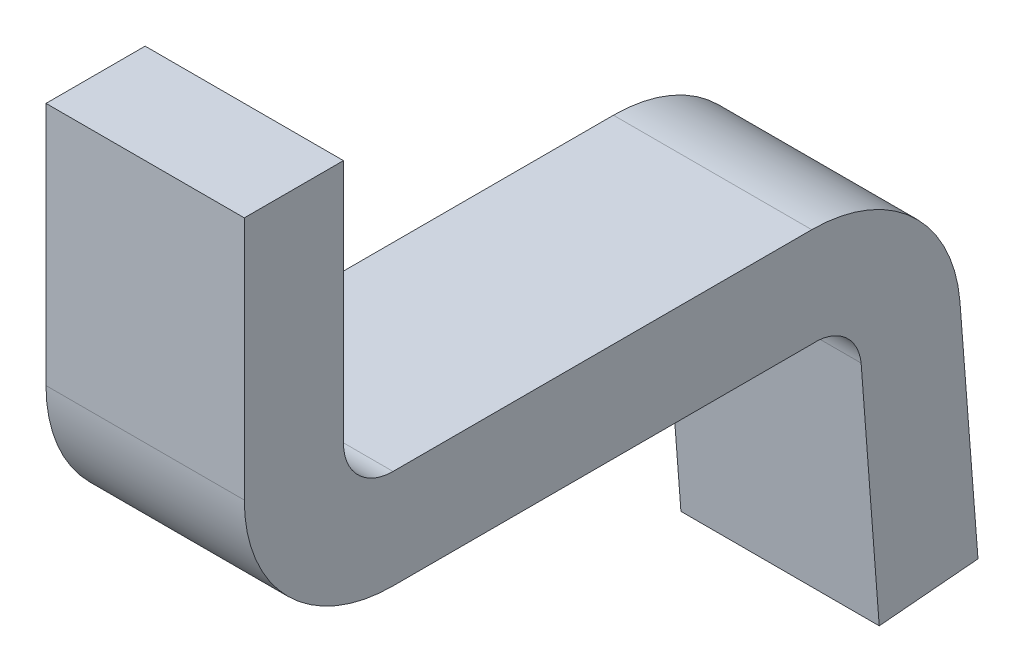
ISO-10303-21;
HEADER;
FILE_DESCRIPTION(('STEP AP214'),'2;1');
FILE_NAME('part.step','',(''),(''),'','','');
FILE_SCHEMA(('AUTOMOTIVE_DESIGN { 1 0 10303 214 1 1 1 1 }'));
ENDSEC;
DATA;
#1=APPLICATION_CONTEXT('core data for automotive mechanical design processes');
#2=APPLICATION_PROTOCOL_DEFINITION('international standard','automotive_design',2000,#1);
#3=PRODUCT_CONTEXT('',#1,'mechanical');
#4=PRODUCT('Part','Part','',(#3));
#5=PRODUCT_RELATED_PRODUCT_CATEGORY('part','',(#4));
#6=PRODUCT_DEFINITION_FORMATION('','',#4);
#7=PRODUCT_DEFINITION_CONTEXT('part definition',#1,'design');
#8=PRODUCT_DEFINITION('design','',#6,#7);
#9=PRODUCT_DEFINITION_SHAPE('','',#8);
#10=(LENGTH_UNIT() NAMED_UNIT(*) SI_UNIT(.MILLI.,.METRE.));
#11=(NAMED_UNIT(*) PLANE_ANGLE_UNIT() SI_UNIT($,.RADIAN.));
#12=(NAMED_UNIT(*) SI_UNIT($,.STERADIAN.) SOLID_ANGLE_UNIT());
#13=UNCERTAINTY_MEASURE_WITH_UNIT(LENGTH_MEASURE(1.E-05),#10,'distance_accuracy_value','');
#14=(GEOMETRIC_REPRESENTATION_CONTEXT(3) GLOBAL_UNCERTAINTY_ASSIGNED_CONTEXT((#13)) GLOBAL_UNIT_ASSIGNED_CONTEXT((#10,
#11,#12)) REPRESENTATION_CONTEXT('',''));
#15=CARTESIAN_POINT('',(0.,0.,0.));
#16=DIRECTION('',(0.,0.,1.));
#17=DIRECTION('',(1.,0.,0.));
#18=AXIS2_PLACEMENT_3D('',#15,#16,#17);
#19=CARTESIAN_POINT('',(2.159,-2.92099999999997,4.21253716297241));
#20=DIRECTION('',(1.,0.,0.));
#21=DIRECTION('',(0.,0.,-1.));
#22=AXIS2_PLACEMENT_3D('',#19,#20,#21);
#23=PLANE('',#22);
#24=DIRECTION('',(0.,0.,1.));
#25=VECTOR('',#24,1.);
#26=CARTESIAN_POINT('',(2.159,-3.04399999999997,3.01873716297246));
#27=LINE('',#26,#25);
#28=CARTESIAN_POINT('',(2.159,-3.04399999999997,4.33953716297241));
#29=VERTEX_POINT('',#28);
#30=CARTESIAN_POINT('',(2.159,-3.04399999999997,4.59353716297242));
#31=VERTEX_POINT('',#30);
#32=EDGE_CURVE('E11',#29,#31,#27,.T.);
#33=ORIENTED_EDGE('',*,*,#32,.T.);
#34=DIRECTION('',(0.,1.,0.));
#35=VECTOR('',#34,1.);
#36=CARTESIAN_POINT('',(2.159,-3.67009500294999,4.59353716297242));
#37=LINE('',#36,#35);
#38=CARTESIAN_POINT('',(2.159,-3.67009500294999,4.59353716297242));
#39=VERTEX_POINT('',#38);
#40=EDGE_CURVE('E25',#39,#31,#37,.T.);
#41=ORIENTED_EDGE('',*,*,#40,.F.);
#42=CARTESIAN_POINT('',(2.159,-3.67009500294998,4.21253716297242));
#43=DIRECTION('',(-1.,0.,0.));
#44=DIRECTION('',(0.,0.,-1.));
#45=AXIS2_PLACEMENT_3D('',#42,#43,#44);
#46=CIRCLE('',#45,0.381000000000003);
#47=CARTESIAN_POINT('',(2.159,-4.05109500294999,4.2125371629724));
#48=VERTEX_POINT('',#47);
#49=EDGE_CURVE('E265',#48,#39,#46,.T.);
#50=ORIENTED_EDGE('',*,*,#49,.F.);
#51=DIRECTION('',(0.,0.,1.));
#52=VECTOR('',#51,1.);
#53=CARTESIAN_POINT('',(2.159,-4.05109500294999,4.21253716297239));
#54=LINE('',#53,#52);
#55=CARTESIAN_POINT('',(2.159,-4.05109500294995,3.13986235176775));
#56=VERTEX_POINT('',#55);
#57=EDGE_CURVE('E154',#56,#48,#54,.T.);
#58=ORIENTED_EDGE('',*,*,#57,.F.);
#59=CARTESIAN_POINT('',(2.159,-4.16880120081053,3.13073416177683));
#60=DIRECTION('',(-1.,0.,0.));
#61=DIRECTION('',(0.,0.,-1.));
#62=AXIS2_PLACEMENT_3D('',#59,#60,#61);
#63=CIRCLE('',#62,0.118059615734191);
#64=CARTESIAN_POINT('',(2.159,-4.15623122362101,3.01334562511009));
#65=VERTEX_POINT('',#64);
#66=EDGE_CURVE('E260',#56,#65,#63,.T.);
#67=ORIENTED_EDGE('',*,*,#66,.T.);
#68=DIRECTION('',(0.,0.997087225412475,0.0762696854540045));
#69=VECTOR('',#68,1.);
#70=CARTESIAN_POINT('',(2.159,-4.15623122362103,3.01334562511009));
#71=LINE('',#70,#69);
#72=CARTESIAN_POINT('',(2.159,-4.76250000000002,2.96697061628789));
#73=VERTEX_POINT('',#72);
#74=EDGE_CURVE('E256',#73,#65,#71,.T.);
#75=ORIENTED_EDGE('',*,*,#74,.F.);
#76=DIRECTION('',(0.,-0.0871557427476652,0.996194698091745));
#77=VECTOR('',#76,1.);
#78=CARTESIAN_POINT('',(2.159,-4.76250000000002,2.96697061628789));
#79=LINE('',#78,#77);
#80=CARTESIAN_POINT('',(2.159,-4.74036244134211,2.71393716297256));
#81=VERTEX_POINT('',#80);
#82=EDGE_CURVE('E252',#81,#73,#79,.T.);
#83=ORIENTED_EDGE('',*,*,#82,.F.);
#84=DIRECTION('',(0.,-0.996981142225432,-0.077644072838003));
#85=VECTOR('',#84,1.);
#86=CARTESIAN_POINT('',(2.159,-4.14488866496312,2.76031217179478));
#87=LINE('',#86,#85);
#88=CARTESIAN_POINT('',(2.159,-4.14488866496311,2.76031217179478));
#89=VERTEX_POINT('',#88);
#90=EDGE_CURVE('E248',#89,#81,#87,.T.);
#91=ORIENTED_EDGE('',*,*,#90,.F.);
#92=CARTESIAN_POINT('',(2.159,-4.17809500294998,3.13986235176773));
#93=DIRECTION('',(-1.,0.,0.));
#94=DIRECTION('',(0.,0.,-1.));
#95=AXIS2_PLACEMENT_3D('',#92,#93,#94);
#96=CIRCLE('',#95,0.381000000000003);
#97=CARTESIAN_POINT('',(2.159,-3.79709500294998,3.13986235176773));
#98=VERTEX_POINT('',#97);
#99=EDGE_CURVE('E244',#98,#89,#96,.T.);
#100=ORIENTED_EDGE('',*,*,#99,.F.);
#101=DIRECTION('',(0.,0.,-1.));
#102=VECTOR('',#101,1.);
#103=CARTESIAN_POINT('',(2.159,-3.79709500294998,4.21253716297241));
#104=LINE('',#103,#102);
#105=CARTESIAN_POINT('',(2.159,-3.79709500294998,4.21253716297242));
#106=VERTEX_POINT('',#105);
#107=EDGE_CURVE('E240',#106,#98,#104,.T.);
#108=ORIENTED_EDGE('',*,*,#107,.F.);
#109=CARTESIAN_POINT('',(2.159,-3.67009500294998,4.21253716297242));
#110=DIRECTION('',(-1.,0.,0.));
#111=DIRECTION('',(0.,0.,-1.));
#112=AXIS2_PLACEMENT_3D('',#109,#110,#111);
#113=CIRCLE('',#112,0.126999999999997);
#114=CARTESIAN_POINT('',(2.159,-3.67009500294998,4.33953716297241));
#115=VERTEX_POINT('',#114);
#116=EDGE_CURVE('E237',#106,#115,#113,.T.);
#117=ORIENTED_EDGE('',*,*,#116,.T.);
#118=DIRECTION('',(0.,-1.,0.));
#119=VECTOR('',#118,1.);
#120=CARTESIAN_POINT('',(2.159,-3.67009500294998,4.33953716297241));
#121=LINE('',#120,#119);
#122=EDGE_CURVE('E233',#29,#115,#121,.T.);
#123=ORIENTED_EDGE('',*,*,#122,.F.);
#124=EDGE_LOOP('',(#33,#41,#50,#58,#67,#75,#83,#91,#100,#108,#117,#123));
#125=FACE_BOUND('',#124,.T.);
#126=ADVANCED_FACE('F17',(#125),#23,.T.);
#127=CARTESIAN_POINT('',(1.651,-3.67009500294999,4.59353716297242));
#128=DIRECTION('',(0.,0.,1.));
#129=DIRECTION('',(1.,0.,0.));
#130=AXIS2_PLACEMENT_3D('',#127,#128,#129);
#131=PLANE('',#130);
#132=DIRECTION('',(1.,0.,0.));
#133=VECTOR('',#132,1.);
#134=CARTESIAN_POINT('',(1.651,-3.04399999999997,4.59353716297242));
#135=LINE('',#134,#133);
#136=CARTESIAN_POINT('',(1.651,-3.04399999999997,4.59353716297242));
#137=VERTEX_POINT('',#136);
#138=EDGE_CURVE('E230',#137,#31,#135,.T.);
#139=ORIENTED_EDGE('',*,*,#138,.F.);
#140=DIRECTION('',(0.,-1.,0.));
#141=VECTOR('',#140,1.);
#142=CARTESIAN_POINT('',(1.651,-2.92099999999997,4.59353716297242));
#143=LINE('',#142,#141);
#144=CARTESIAN_POINT('',(1.651,-3.67009500294999,4.59353716297242));
#145=VERTEX_POINT('',#144);
#146=EDGE_CURVE('E227',#137,#145,#143,.T.);
#147=ORIENTED_EDGE('',*,*,#146,.T.);
#148=DIRECTION('',(-1.,0.,0.));
#149=VECTOR('',#148,1.);
#150=CARTESIAN_POINT('',(1.651,-3.67009500294999,4.59353716297242));
#151=LINE('',#150,#149);
#152=EDGE_CURVE('E148',#39,#145,#151,.T.);
#153=ORIENTED_EDGE('',*,*,#152,.F.);
#154=ORIENTED_EDGE('',*,*,#40,.T.);
#155=EDGE_LOOP('',(#139,#147,#153,#154));
#156=FACE_BOUND('',#155,.T.);
#157=ADVANCED_FACE('F269',(#156),#131,.T.);
#158=CARTESIAN_POINT('',(1.651,-2.92099999999997,4.21253716297241));
#159=DIRECTION('',(1.,0.,0.));
#160=DIRECTION('',(0.,0.,-1.));
#161=AXIS2_PLACEMENT_3D('',#158,#159,#160);
#162=PLANE('',#161);
#163=DIRECTION('',(0.,0.,-1.));
#164=VECTOR('',#163,1.);
#165=CARTESIAN_POINT('',(1.651,-3.04399999999997,4.21253716297241));
#166=LINE('',#165,#164);
#167=CARTESIAN_POINT('',(1.651,-3.04399999999997,4.33953716297241));
#168=VERTEX_POINT('',#167);
#169=EDGE_CURVE('E222',#137,#168,#166,.T.);
#170=ORIENTED_EDGE('',*,*,#169,.T.);
#171=DIRECTION('',(0.,1.,0.));
#172=VECTOR('',#171,1.);
#173=CARTESIAN_POINT('',(1.651,-2.92099999999997,4.33953716297241));
#174=LINE('',#173,#172);
#175=CARTESIAN_POINT('',(1.651,-3.67009500294998,4.33953716297241));
#176=VERTEX_POINT('',#175);
#177=EDGE_CURVE('E218',#176,#168,#174,.T.);
#178=ORIENTED_EDGE('',*,*,#177,.F.);
#179=CARTESIAN_POINT('',(1.651,-3.67009500294998,4.21253716297242));
#180=DIRECTION('',(-1.,0.,0.));
#181=DIRECTION('',(0.,0.,-1.));
#182=AXIS2_PLACEMENT_3D('',#179,#180,#181);
#183=CIRCLE('',#182,0.126999999999997);
#184=CARTESIAN_POINT('',(1.651,-3.79709500294998,4.21253716297242));
#185=VERTEX_POINT('',#184);
#186=EDGE_CURVE('E214',#185,#176,#183,.T.);
#187=ORIENTED_EDGE('',*,*,#186,.F.);
#188=DIRECTION('',(0.,0.,1.));
#189=VECTOR('',#188,1.);
#190=CARTESIAN_POINT('',(1.651,-3.79709500294998,4.21253716297241));
#191=LINE('',#190,#189);
#192=CARTESIAN_POINT('',(1.651,-3.79709500294998,3.13986235176773));
#193=VERTEX_POINT('',#192);
#194=EDGE_CURVE('E210',#193,#185,#191,.T.);
#195=ORIENTED_EDGE('',*,*,#194,.F.);
#196=CARTESIAN_POINT('',(1.651,-4.17809500294998,3.13986235176773));
#197=DIRECTION('',(1.,0.,0.));
#198=DIRECTION('',(0.,0.,-1.));
#199=AXIS2_PLACEMENT_3D('',#196,#197,#198);
#200=CIRCLE('',#199,0.381000000000003);
#201=CARTESIAN_POINT('',(1.651,-4.14488866496311,2.76031217179478));
#202=VERTEX_POINT('',#201);
#203=EDGE_CURVE('E206',#202,#193,#200,.T.);
#204=ORIENTED_EDGE('',*,*,#203,.F.);
#205=DIRECTION('',(0.,0.996981142225432,0.077644072838003));
#206=VECTOR('',#205,1.);
#207=CARTESIAN_POINT('',(1.651,-4.74036244134211,2.71393716297256));
#208=LINE('',#207,#206);
#209=CARTESIAN_POINT('',(1.651,-4.74036244134211,2.71393716297256));
#210=VERTEX_POINT('',#209);
#211=EDGE_CURVE('E202',#210,#202,#208,.T.);
#212=ORIENTED_EDGE('',*,*,#211,.F.);
#213=DIRECTION('',(0.,0.0871557427476652,-0.996194698091745));
#214=VECTOR('',#213,1.);
#215=CARTESIAN_POINT('',(1.651,-4.76250000000002,2.96697061628789));
#216=LINE('',#215,#214);
#217=CARTESIAN_POINT('',(1.651,-4.76250000000002,2.96697061628789));
#218=VERTEX_POINT('',#217);
#219=EDGE_CURVE('E198',#218,#210,#216,.T.);
#220=ORIENTED_EDGE('',*,*,#219,.F.);
#221=DIRECTION('',(0.,-0.997087225412475,-0.0762696854540024));
#222=VECTOR('',#221,1.);
#223=CARTESIAN_POINT('',(1.651,-4.15623122362103,3.01334562511009));
#224=LINE('',#223,#222);
#225=CARTESIAN_POINT('',(1.651,-4.15623122362103,3.01334562511009));
#226=VERTEX_POINT('',#225);
#227=EDGE_CURVE('E194',#226,#218,#224,.T.);
#228=ORIENTED_EDGE('',*,*,#227,.F.);
#229=CARTESIAN_POINT('',(1.651,-4.16880120081053,3.13073416177683));
#230=DIRECTION('',(-1.,0.,0.));
#231=DIRECTION('',(0.,0.,-1.));
#232=AXIS2_PLACEMENT_3D('',#229,#230,#231);
#233=CIRCLE('',#232,0.118059615734191);
#234=CARTESIAN_POINT('',(1.651,-4.05109500294997,3.13986235176797));
#235=VERTEX_POINT('',#234);
#236=EDGE_CURVE('E134',#235,#226,#233,.T.);
#237=ORIENTED_EDGE('',*,*,#236,.F.);
#238=DIRECTION('',(0.,0.,-1.));
#239=VECTOR('',#238,1.);
#240=CARTESIAN_POINT('',(1.651,-4.05109500294999,4.21253716297241));
#241=LINE('',#240,#239);
#242=CARTESIAN_POINT('',(1.651,-4.05109500294999,4.2125371629724));
#243=VERTEX_POINT('',#242);
#244=EDGE_CURVE('E128',#243,#235,#241,.T.);
#245=ORIENTED_EDGE('',*,*,#244,.F.);
#246=CARTESIAN_POINT('',(1.651,-3.67009500294998,4.21253716297242));
#247=DIRECTION('',(1.,0.,0.));
#248=DIRECTION('',(0.,0.,-1.));
#249=AXIS2_PLACEMENT_3D('',#246,#247,#248);
#250=CIRCLE('',#249,0.381000000000003);
#251=EDGE_CURVE('E132',#145,#243,#250,.T.);
#252=ORIENTED_EDGE('',*,*,#251,.F.);
#253=ORIENTED_EDGE('',*,*,#146,.F.);
#254=EDGE_LOOP('',(#170,#178,#187,#195,#204,#212,#220,#228,#237,#245,#252,#253));
#255=FACE_BOUND('',#254,.T.);
#256=ADVANCED_FACE('F130',(#255),#162,.F.);
#257=CARTESIAN_POINT('',(1.651,-3.67009500294998,4.33953716297241));
#258=DIRECTION('',(0.,0.,-1.));
#259=DIRECTION('',(-1.,0.,0.));
#260=AXIS2_PLACEMENT_3D('',#257,#258,#259);
#261=PLANE('',#260);
#262=DIRECTION('',(-1.,0.,0.));
#263=VECTOR('',#262,1.);
#264=CARTESIAN_POINT('',(1.651,-3.04399999999997,4.33953716297241));
#265=LINE('',#264,#263);
#266=EDGE_CURVE('E150',#29,#168,#265,.T.);
#267=ORIENTED_EDGE('',*,*,#266,.F.);
#268=ORIENTED_EDGE('',*,*,#122,.T.);
#269=DIRECTION('',(-1.,0.,0.));
#270=VECTOR('',#269,1.);
#271=CARTESIAN_POINT('',(1.651,-3.67009500294998,4.33953716297241));
#272=LINE('',#271,#270);
#273=EDGE_CURVE('E186',#115,#176,#272,.T.);
#274=ORIENTED_EDGE('',*,*,#273,.T.);
#275=ORIENTED_EDGE('',*,*,#177,.T.);
#276=EDGE_LOOP('',(#267,#268,#274,#275));
#277=FACE_BOUND('',#276,.T.);
#278=ADVANCED_FACE('F274',(#277),#261,.T.);
#279=CARTESIAN_POINT('',(1.651,-3.04399999999997,3.01873716297246));
#280=DIRECTION('',(0.,-1.,0.));
#281=DIRECTION('',(0.,0.,-1.));
#282=AXIS2_PLACEMENT_3D('',#279,#280,#281);
#283=PLANE('',#282);
#284=ORIENTED_EDGE('',*,*,#32,.F.);
#285=ORIENTED_EDGE('',*,*,#266,.T.);
#286=ORIENTED_EDGE('',*,*,#169,.F.);
#287=ORIENTED_EDGE('',*,*,#138,.T.);
#288=EDGE_LOOP('',(#284,#285,#286,#287));
#289=FACE_BOUND('',#288,.T.);
#290=ADVANCED_FACE('F271',(#289),#283,.F.);
#291=CARTESIAN_POINT('',(1.651,-3.67009500294998,4.21253716297242));
#292=DIRECTION('',(1.,0.,0.));
#293=DIRECTION('',(0.,0.,-1.));
#294=AXIS2_PLACEMENT_3D('',#291,#292,#293);
#295=CYLINDRICAL_SURFACE('',#294,0.126999999999997);
#296=ORIENTED_EDGE('',*,*,#116,.F.);
#297=DIRECTION('',(1.,0.,0.));
#298=VECTOR('',#297,1.);
#299=CARTESIAN_POINT('',(1.651,-3.79709500294998,4.21253716297241));
#300=LINE('',#299,#298);
#301=EDGE_CURVE('E182',#185,#106,#300,.T.);
#302=ORIENTED_EDGE('',*,*,#301,.F.);
#303=ORIENTED_EDGE('',*,*,#186,.T.);
#304=ORIENTED_EDGE('',*,*,#273,.F.);
#305=EDGE_LOOP('',(#296,#302,#303,#304));
#306=FACE_BOUND('',#305,.T.);
#307=ADVANCED_FACE('F278',(#306),#295,.F.);
#308=CARTESIAN_POINT('',(1.651,-3.79709500294998,4.21253716297241));
#309=DIRECTION('',(0.,1.,0.));
#310=DIRECTION('',(0.,0.,1.));
#311=AXIS2_PLACEMENT_3D('',#308,#309,#310);
#312=PLANE('',#311);
#313=DIRECTION('',(-1.,0.,0.));
#314=VECTOR('',#313,1.);
#315=CARTESIAN_POINT('',(1.651,-3.79709500294998,3.13986235176773));
#316=LINE('',#315,#314);
#317=EDGE_CURVE('E178',#98,#193,#316,.T.);
#318=ORIENTED_EDGE('',*,*,#317,.T.);
#319=ORIENTED_EDGE('',*,*,#194,.T.);
#320=ORIENTED_EDGE('',*,*,#301,.T.);
#321=ORIENTED_EDGE('',*,*,#107,.T.);
#322=EDGE_LOOP('',(#318,#319,#320,#321));
#323=FACE_BOUND('',#322,.T.);
#324=ADVANCED_FACE('F281',(#323),#312,.T.);
#325=CARTESIAN_POINT('',(1.651,-4.17809500294998,3.13986235176773));
#326=DIRECTION('',(1.,0.,0.));
#327=DIRECTION('',(0.,0.,-1.));
#328=AXIS2_PLACEMENT_3D('',#325,#326,#327);
#329=CYLINDRICAL_SURFACE('',#328,0.381000000000003);
#330=DIRECTION('',(-1.,0.,0.));
#331=VECTOR('',#330,1.);
#332=CARTESIAN_POINT('',(1.651,-4.14488866496312,2.76031217179478));
#333=LINE('',#332,#331);
#334=EDGE_CURVE('E174',#89,#202,#333,.T.);
#335=ORIENTED_EDGE('',*,*,#334,.T.);
#336=ORIENTED_EDGE('',*,*,#203,.T.);
#337=ORIENTED_EDGE('',*,*,#317,.F.);
#338=ORIENTED_EDGE('',*,*,#99,.T.);
#339=EDGE_LOOP('',(#335,#336,#337,#338));
#340=FACE_BOUND('',#339,.T.);
#341=ADVANCED_FACE('F284',(#340),#329,.T.);
#342=CARTESIAN_POINT('',(1.651,-4.14488866496312,2.76031217179478));
#343=DIRECTION('',(0.,0.077644072838003,-0.996981142225432));
#344=DIRECTION('',(0.,0.996981142225432,0.077644072838003));
#345=AXIS2_PLACEMENT_3D('',#342,#343,#344);
#346=PLANE('',#345);
#347=DIRECTION('',(-1.,0.,0.));
#348=VECTOR('',#347,1.);
#349=CARTESIAN_POINT('',(1.651,-4.74036244134211,2.71393716297256));
#350=LINE('',#349,#348);
#351=EDGE_CURVE('E170',#81,#210,#350,.T.);
#352=ORIENTED_EDGE('',*,*,#351,.T.);
#353=ORIENTED_EDGE('',*,*,#211,.T.);
#354=ORIENTED_EDGE('',*,*,#334,.F.);
#355=ORIENTED_EDGE('',*,*,#90,.T.);
#356=EDGE_LOOP('',(#352,#353,#354,#355));
#357=FACE_BOUND('',#356,.T.);
#358=ADVANCED_FACE('F287',(#357),#346,.T.);
#359=CARTESIAN_POINT('',(1.651,-4.76250000000002,2.96697061628789));
#360=DIRECTION('',(0.,-0.996194698091745,-0.0871557427476653));
#361=DIRECTION('',(0.,0.0871557427476653,-0.996194698091745));
#362=AXIS2_PLACEMENT_3D('',#359,#360,#361);
#363=PLANE('',#362);
#364=DIRECTION('',(-1.,0.,0.));
#365=VECTOR('',#364,1.);
#366=CARTESIAN_POINT('',(1.651,-4.76250000000002,2.96697061628789));
#367=LINE('',#366,#365);
#368=EDGE_CURVE('E166',#73,#218,#367,.T.);
#369=ORIENTED_EDGE('',*,*,#368,.T.);
#370=ORIENTED_EDGE('',*,*,#219,.T.);
#371=ORIENTED_EDGE('',*,*,#351,.F.);
#372=ORIENTED_EDGE('',*,*,#82,.T.);
#373=EDGE_LOOP('',(#369,#370,#371,#372));
#374=FACE_BOUND('',#373,.T.);
#375=ADVANCED_FACE('F290',(#374),#363,.T.);
#376=CARTESIAN_POINT('',(1.651,-4.15623122362103,3.01334562511009));
#377=DIRECTION('',(0.,-0.0762696854540045,0.997087225412475));
#378=DIRECTION('',(0.,-0.997087225412475,-0.0762696854540045));
#379=AXIS2_PLACEMENT_3D('',#376,#377,#378);
#380=PLANE('',#379);
#381=DIRECTION('',(-1.,0.,0.));
#382=VECTOR('',#381,1.);
#383=CARTESIAN_POINT('',(1.651,-4.15623122362103,3.01334562511009));
#384=LINE('',#383,#382);
#385=EDGE_CURVE('E160',#65,#226,#384,.T.);
#386=ORIENTED_EDGE('',*,*,#385,.T.);
#387=ORIENTED_EDGE('',*,*,#227,.T.);
#388=ORIENTED_EDGE('',*,*,#368,.F.);
#389=ORIENTED_EDGE('',*,*,#74,.T.);
#390=EDGE_LOOP('',(#386,#387,#388,#389));
#391=FACE_BOUND('',#390,.T.);
#392=ADVANCED_FACE('F293',(#391),#380,.T.);
#393=CARTESIAN_POINT('',(1.651,-4.16880120081053,3.13073416177683));
#394=DIRECTION('',(1.,0.,0.));
#395=DIRECTION('',(0.,0.,-1.));
#396=AXIS2_PLACEMENT_3D('',#393,#394,#395);
#397=CYLINDRICAL_SURFACE('',#396,0.118059615734191);
#398=ORIENTED_EDGE('',*,*,#66,.F.);
#399=DIRECTION('',(1.,0.,0.));
#400=VECTOR('',#399,1.);
#401=CARTESIAN_POINT('',(1.651,-4.05109500294995,3.13986235176776));
#402=LINE('',#401,#400);
#403=EDGE_CURVE('E156',#235,#56,#402,.T.);
#404=ORIENTED_EDGE('',*,*,#403,.F.);
#405=ORIENTED_EDGE('',*,*,#236,.T.);
#406=ORIENTED_EDGE('',*,*,#385,.F.);
#407=EDGE_LOOP('',(#398,#404,#405,#406));
#408=FACE_BOUND('',#407,.T.);
#409=ADVANCED_FACE('F297',(#408),#397,.F.);
#410=CARTESIAN_POINT('',(1.651,-4.05109500294999,4.21253716297239));
#411=DIRECTION('',(0.,-1.,0.));
#412=DIRECTION('',(0.,0.,-1.));
#413=AXIS2_PLACEMENT_3D('',#410,#411,#412);
#414=PLANE('',#413);
#415=DIRECTION('',(-1.,0.,0.));
#416=VECTOR('',#415,1.);
#417=CARTESIAN_POINT('',(1.651,-4.05109500294999,4.21253716297239));
#418=LINE('',#417,#416);
#419=EDGE_CURVE('E146',#48,#243,#418,.T.);
#420=ORIENTED_EDGE('',*,*,#419,.T.);
#421=ORIENTED_EDGE('',*,*,#244,.T.);
#422=ORIENTED_EDGE('',*,*,#403,.T.);
#423=ORIENTED_EDGE('',*,*,#57,.T.);
#424=EDGE_LOOP('',(#420,#421,#422,#423));
#425=FACE_BOUND('',#424,.T.);
#426=ADVANCED_FACE('F153',(#425),#414,.T.);
#427=CARTESIAN_POINT('',(1.651,-3.67009500294998,4.21253716297242));
#428=DIRECTION('',(1.,0.,0.));
#429=DIRECTION('',(0.,0.,-1.));
#430=AXIS2_PLACEMENT_3D('',#427,#428,#429);
#431=CYLINDRICAL_SURFACE('',#430,0.381000000000003);
#432=ORIENTED_EDGE('',*,*,#152,.T.);
#433=ORIENTED_EDGE('',*,*,#251,.T.);
#434=ORIENTED_EDGE('',*,*,#419,.F.);
#435=ORIENTED_EDGE('',*,*,#49,.T.);
#436=EDGE_LOOP('',(#432,#433,#434,#435));
#437=FACE_BOUND('',#436,.T.);
#438=ADVANCED_FACE('F144',(#437),#431,.T.);
#439=CLOSED_SHELL('',(#126,#157,#256,#278,#290,#307,#324,#341,#358,#375,#392,#409,#426,#438));
#440=MANIFOLD_SOLID_BREP('B1',#439);
#441=ADVANCED_BREP_SHAPE_REPRESENTATION('',(#18,#440),#14);
#442=SHAPE_DEFINITION_REPRESENTATION(#9,#441);
ENDSEC;
END-ISO-10303-21;
